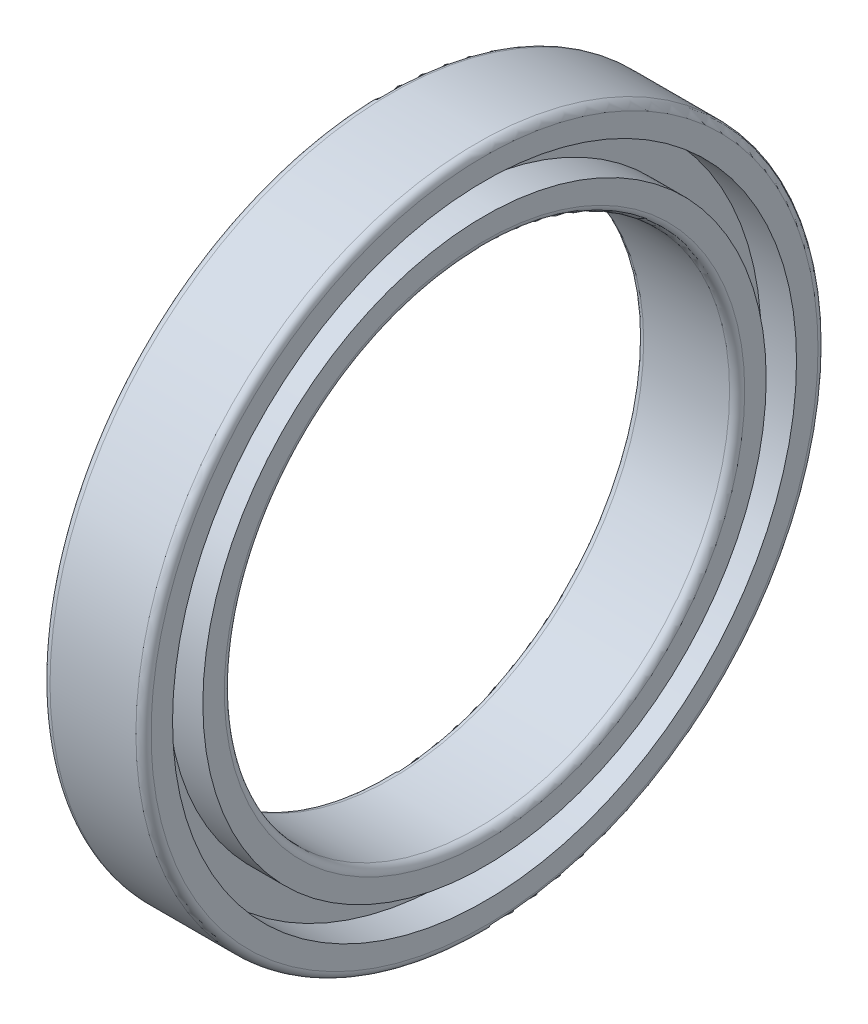
ISO-10303-21;
HEADER;
FILE_DESCRIPTION(('STEP AP214'),'2;1');
FILE_NAME('part.step','',(''),(''),'','','');
FILE_SCHEMA(('AUTOMOTIVE_DESIGN { 1 0 10303 214 1 1 1 1 }'));
ENDSEC;
DATA;
#1=APPLICATION_CONTEXT('core data for automotive mechanical design processes');
#2=APPLICATION_PROTOCOL_DEFINITION('international standard','automotive_design',2000,#1);
#3=PRODUCT_CONTEXT('',#1,'mechanical');
#4=PRODUCT('Part','Part','',(#3));
#5=PRODUCT_RELATED_PRODUCT_CATEGORY('part','',(#4));
#6=PRODUCT_DEFINITION_FORMATION('','',#4);
#7=PRODUCT_DEFINITION_CONTEXT('part definition',#1,'design');
#8=PRODUCT_DEFINITION('design','',#6,#7);
#9=PRODUCT_DEFINITION_SHAPE('','',#8);
#10=(LENGTH_UNIT() NAMED_UNIT(*) SI_UNIT(.MILLI.,.METRE.));
#11=(NAMED_UNIT(*) PLANE_ANGLE_UNIT() SI_UNIT($,.RADIAN.));
#12=(NAMED_UNIT(*) SI_UNIT($,.STERADIAN.) SOLID_ANGLE_UNIT());
#13=UNCERTAINTY_MEASURE_WITH_UNIT(LENGTH_MEASURE(1.E-05),#10,'distance_accuracy_value','');
#14=(GEOMETRIC_REPRESENTATION_CONTEXT(3) GLOBAL_UNCERTAINTY_ASSIGNED_CONTEXT((#13)) GLOBAL_UNIT_ASSIGNED_CONTEXT((#10,
#11,#12)) REPRESENTATION_CONTEXT('',''));
#15=CARTESIAN_POINT('',(0.,0.,0.));
#16=DIRECTION('',(0.,0.,1.));
#17=DIRECTION('',(1.,0.,0.));
#18=AXIS2_PLACEMENT_3D('',#15,#16,#17);
#19=CARTESIAN_POINT('',(-1.7,0.,0.));
#20=DIRECTION('',(1.,0.,0.));
#21=DIRECTION('',(0.,0.,-1.));
#22=AXIS2_PLACEMENT_3D('',#19,#20,#21);
#23=TOROIDAL_SURFACE('',#22,13.2,0.3);
#24=CARTESIAN_POINT('',(-2.,0.,0.));
#25=DIRECTION('',(1.,0.,0.));
#26=DIRECTION('',(0.,0.,-1.));
#27=AXIS2_PLACEMENT_3D('',#24,#25,#26);
#28=CIRCLE('',#27,13.2);
#29=CARTESIAN_POINT('',(-2.,0.,-13.2));
#30=VERTEX_POINT('',#29);
#31=EDGE_CURVE('E10',#30,#30,#28,.T.);
#32=ORIENTED_EDGE('',*,*,#31,.T.);
#33=EDGE_LOOP('',(#32));
#34=FACE_BOUND('',#33,.T.);
#35=CARTESIAN_POINT('',(-1.7,0.,0.));
#36=DIRECTION('',(1.,0.,0.));
#37=DIRECTION('',(0.,0.,-1.));
#38=AXIS2_PLACEMENT_3D('',#35,#36,#37);
#39=CIRCLE('',#38,13.5);
#40=CARTESIAN_POINT('',(-1.7,0.,-13.5));
#41=VERTEX_POINT('',#40);
#42=EDGE_CURVE('E121',#41,#41,#39,.T.);
#43=ORIENTED_EDGE('',*,*,#42,.F.);
#44=EDGE_LOOP('',(#43));
#45=FACE_BOUND('',#44,.T.);
#46=ADVANCED_FACE('F16',(#34,#45),#23,.T.);
#47=CARTESIAN_POINT('',(-2.,12.35,0.));
#48=DIRECTION('',(1.,0.,0.));
#49=DIRECTION('',(0.,1.,0.));
#50=AXIS2_PLACEMENT_3D('',#47,#48,#49);
#51=PLANE('',#50);
#52=CARTESIAN_POINT('',(-2.,0.,0.));
#53=DIRECTION('',(1.,0.,0.));
#54=DIRECTION('',(0.,0.,-1.));
#55=AXIS2_PLACEMENT_3D('',#52,#53,#54);
#56=CIRCLE('',#55,12.35);
#57=CARTESIAN_POINT('',(-2.,0.,-12.35));
#58=VERTEX_POINT('',#57);
#59=EDGE_CURVE('E25',#58,#58,#56,.T.);
#60=ORIENTED_EDGE('',*,*,#59,.T.);
#61=EDGE_LOOP('',(#60));
#62=FACE_BOUND('',#61,.T.);
#63=ORIENTED_EDGE('',*,*,#31,.F.);
#64=EDGE_LOOP('',(#63));
#65=FACE_BOUND('',#64,.T.);
#66=ADVANCED_FACE('F157',(#62,#65),#51,.F.);
#67=CARTESIAN_POINT('',(2.,0.,0.));
#68=DIRECTION('',(-1.,0.,0.));
#69=DIRECTION('',(0.,0.,-1.));
#70=AXIS2_PLACEMENT_3D('',#67,#68,#69);
#71=CYLINDRICAL_SURFACE('',#70,12.35);
#72=ORIENTED_EDGE('',*,*,#59,.F.);
#73=EDGE_LOOP('',(#72));
#74=FACE_BOUND('',#73,.T.);
#75=CARTESIAN_POINT('',(-0.6,0.,0.));
#76=DIRECTION('',(1.,0.,0.));
#77=DIRECTION('',(0.,0.,-1.));
#78=AXIS2_PLACEMENT_3D('',#75,#76,#77);
#79=CIRCLE('',#78,12.35);
#80=CARTESIAN_POINT('',(-0.6,0.,-12.35));
#81=VERTEX_POINT('',#80);
#82=EDGE_CURVE('E136',#81,#81,#79,.T.);
#83=ORIENTED_EDGE('',*,*,#82,.T.);
#84=EDGE_LOOP('',(#83));
#85=FACE_BOUND('',#84,.T.);
#86=ADVANCED_FACE('F142',(#74,#85),#71,.F.);
#87=CARTESIAN_POINT('',(-0.6,11.15,0.));
#88=DIRECTION('',(1.,0.,0.));
#89=DIRECTION('',(0.,1.,0.));
#90=AXIS2_PLACEMENT_3D('',#87,#88,#89);
#91=PLANE('',#90);
#92=CARTESIAN_POINT('',(-0.6,0.,0.));
#93=DIRECTION('',(1.,0.,0.));
#94=DIRECTION('',(0.,0.,-1.));
#95=AXIS2_PLACEMENT_3D('',#92,#93,#94);
#96=CIRCLE('',#95,11.15);
#97=CARTESIAN_POINT('',(-0.6,0.,-11.15));
#98=VERTEX_POINT('',#97);
#99=EDGE_CURVE('E107',#98,#98,#96,.T.);
#100=ORIENTED_EDGE('',*,*,#99,.T.);
#101=EDGE_LOOP('',(#100));
#102=FACE_BOUND('',#101,.T.);
#103=ORIENTED_EDGE('',*,*,#82,.F.);
#104=EDGE_LOOP('',(#103));
#105=FACE_BOUND('',#104,.T.);
#106=ADVANCED_FACE('F144',(#102,#105),#91,.F.);
#107=CARTESIAN_POINT('',(1.7,0.,0.));
#108=DIRECTION('',(1.,0.,0.));
#109=DIRECTION('',(0.,0.,-1.));
#110=AXIS2_PLACEMENT_3D('',#107,#108,#109);
#111=TOROIDAL_SURFACE('',#110,10.3,0.3);
#112=CARTESIAN_POINT('',(2.,0.,0.));
#113=DIRECTION('',(1.,0.,0.));
#114=DIRECTION('',(0.,0.,-1.));
#115=AXIS2_PLACEMENT_3D('',#112,#113,#114);
#116=CIRCLE('',#115,10.3);
#117=CARTESIAN_POINT('',(2.,0.,-10.3));
#118=VERTEX_POINT('',#117);
#119=EDGE_CURVE('E97',#118,#118,#116,.T.);
#120=ORIENTED_EDGE('',*,*,#119,.T.);
#121=EDGE_LOOP('',(#120));
#122=FACE_BOUND('',#121,.T.);
#123=CARTESIAN_POINT('',(1.7,0.,0.));
#124=DIRECTION('',(1.,0.,0.));
#125=DIRECTION('',(0.,0.,-1.));
#126=AXIS2_PLACEMENT_3D('',#123,#124,#125);
#127=CIRCLE('',#126,10.);
#128=CARTESIAN_POINT('',(1.7,0.,-10.));
#129=VERTEX_POINT('',#128);
#130=EDGE_CURVE('E133',#129,#129,#127,.T.);
#131=ORIENTED_EDGE('',*,*,#130,.F.);
#132=EDGE_LOOP('',(#131));
#133=FACE_BOUND('',#132,.T.);
#134=ADVANCED_FACE('F146',(#122,#133),#111,.T.);
#135=CARTESIAN_POINT('',(50.,0.,0.));
#136=DIRECTION('',(-1.,0.,0.));
#137=DIRECTION('',(0.,0.,-1.));
#138=AXIS2_PLACEMENT_3D('',#135,#136,#137);
#139=CYLINDRICAL_SURFACE('',#138,10.);
#140=ORIENTED_EDGE('',*,*,#130,.T.);
#141=EDGE_LOOP('',(#140));
#142=FACE_BOUND('',#141,.T.);
#143=CARTESIAN_POINT('',(-1.7,0.,0.));
#144=DIRECTION('',(1.,0.,0.));
#145=DIRECTION('',(0.,0.,-1.));
#146=AXIS2_PLACEMENT_3D('',#143,#144,#145);
#147=CIRCLE('',#146,10.);
#148=CARTESIAN_POINT('',(-1.7,0.,-10.));
#149=VERTEX_POINT('',#148);
#150=EDGE_CURVE('E130',#149,#149,#147,.T.);
#151=ORIENTED_EDGE('',*,*,#150,.F.);
#152=EDGE_LOOP('',(#151));
#153=FACE_BOUND('',#152,.T.);
#154=ADVANCED_FACE('F154',(#142,#153),#139,.F.);
#155=CARTESIAN_POINT('',(-1.7,0.,0.));
#156=DIRECTION('',(1.,0.,0.));
#157=DIRECTION('',(0.,0.,-1.));
#158=AXIS2_PLACEMENT_3D('',#155,#156,#157);
#159=TOROIDAL_SURFACE('',#158,10.3,0.3);
#160=ORIENTED_EDGE('',*,*,#150,.T.);
#161=EDGE_LOOP('',(#160));
#162=FACE_BOUND('',#161,.T.);
#163=CARTESIAN_POINT('',(-2.,0.,0.));
#164=DIRECTION('',(1.,0.,0.));
#165=DIRECTION('',(0.,0.,-1.));
#166=AXIS2_PLACEMENT_3D('',#163,#164,#165);
#167=CIRCLE('',#166,10.3);
#168=CARTESIAN_POINT('',(-2.,0.,-10.3));
#169=VERTEX_POINT('',#168);
#170=EDGE_CURVE('E104',#169,#169,#167,.T.);
#171=ORIENTED_EDGE('',*,*,#170,.F.);
#172=EDGE_LOOP('',(#171));
#173=FACE_BOUND('',#172,.T.);
#174=ADVANCED_FACE('F187',(#162,#173),#159,.T.);
#175=CARTESIAN_POINT('',(2.,0.,0.));
#176=DIRECTION('',(-1.,0.,0.));
#177=DIRECTION('',(0.,0.,-1.));
#178=AXIS2_PLACEMENT_3D('',#175,#176,#177);
#179=CYLINDRICAL_SURFACE('',#178,11.15);
#180=ORIENTED_EDGE('',*,*,#99,.F.);
#181=EDGE_LOOP('',(#180));
#182=FACE_BOUND('',#181,.T.);
#183=CARTESIAN_POINT('',(-2.,0.,0.));
#184=DIRECTION('',(1.,0.,0.));
#185=DIRECTION('',(0.,0.,-1.));
#186=AXIS2_PLACEMENT_3D('',#183,#184,#185);
#187=CIRCLE('',#186,11.15);
#188=CARTESIAN_POINT('',(-2.,0.,-11.15));
#189=VERTEX_POINT('',#188);
#190=EDGE_CURVE('E108',#189,#189,#187,.T.);
#191=ORIENTED_EDGE('',*,*,#190,.T.);
#192=EDGE_LOOP('',(#191));
#193=FACE_BOUND('',#192,.T.);
#194=ADVANCED_FACE('F181',(#182,#193),#179,.T.);
#195=CARTESIAN_POINT('',(-2.,0.,0.));
#196=DIRECTION('',(1.,0.,0.));
#197=DIRECTION('',(0.,1.,0.));
#198=AXIS2_PLACEMENT_3D('',#195,#196,#197);
#199=PLANE('',#198);
#200=ORIENTED_EDGE('',*,*,#170,.T.);
#201=EDGE_LOOP('',(#200));
#202=FACE_BOUND('',#201,.T.);
#203=ORIENTED_EDGE('',*,*,#190,.F.);
#204=EDGE_LOOP('',(#203));
#205=FACE_BOUND('',#204,.T.);
#206=ADVANCED_FACE('F171',(#202,#205),#199,.F.);
#207=CARTESIAN_POINT('',(2.,0.,0.));
#208=DIRECTION('',(-1.,0.,0.));
#209=DIRECTION('',(0.,0.,-1.));
#210=AXIS2_PLACEMENT_3D('',#207,#208,#209);
#211=CYLINDRICAL_SURFACE('',#210,13.5);
#212=CARTESIAN_POINT('',(1.7,0.,0.));
#213=DIRECTION('',(1.,0.,0.));
#214=DIRECTION('',(0.,0.,-1.));
#215=AXIS2_PLACEMENT_3D('',#212,#213,#214);
#216=CIRCLE('',#215,13.5);
#217=CARTESIAN_POINT('',(1.7,0.,-13.5));
#218=VERTEX_POINT('',#217);
#219=EDGE_CURVE('E120',#218,#218,#216,.T.);
#220=ORIENTED_EDGE('',*,*,#219,.F.);
#221=EDGE_LOOP('',(#220));
#222=FACE_BOUND('',#221,.T.);
#223=ORIENTED_EDGE('',*,*,#42,.T.);
#224=EDGE_LOOP('',(#223));
#225=FACE_BOUND('',#224,.T.);
#226=ADVANCED_FACE('F168',(#222,#225),#211,.T.);
#227=CARTESIAN_POINT('',(1.7,0.,0.));
#228=DIRECTION('',(1.,0.,0.));
#229=DIRECTION('',(0.,0.,-1.));
#230=AXIS2_PLACEMENT_3D('',#227,#228,#229);
#231=TOROIDAL_SURFACE('',#230,13.2,0.3);
#232=ORIENTED_EDGE('',*,*,#219,.T.);
#233=EDGE_LOOP('',(#232));
#234=FACE_BOUND('',#233,.T.);
#235=CARTESIAN_POINT('',(2.,0.,0.));
#236=DIRECTION('',(1.,0.,0.));
#237=DIRECTION('',(0.,0.,-1.));
#238=AXIS2_PLACEMENT_3D('',#235,#236,#237);
#239=CIRCLE('',#238,13.2);
#240=CARTESIAN_POINT('',(2.,0.,-13.2));
#241=VERTEX_POINT('',#240);
#242=EDGE_CURVE('E117',#241,#241,#239,.T.);
#243=ORIENTED_EDGE('',*,*,#242,.F.);
#244=EDGE_LOOP('',(#243));
#245=FACE_BOUND('',#244,.T.);
#246=ADVANCED_FACE('F170',(#234,#245),#231,.T.);
#247=CARTESIAN_POINT('',(2.,13.2,0.));
#248=DIRECTION('',(-1.,0.,0.));
#249=DIRECTION('',(0.,0.,1.));
#250=AXIS2_PLACEMENT_3D('',#247,#248,#249);
#251=PLANE('',#250);
#252=CARTESIAN_POINT('',(2.,0.,0.));
#253=DIRECTION('',(1.,0.,0.));
#254=DIRECTION('',(0.,0.,-1.));
#255=AXIS2_PLACEMENT_3D('',#252,#253,#254);
#256=CIRCLE('',#255,12.35);
#257=CARTESIAN_POINT('',(2.,0.,-12.35));
#258=VERTEX_POINT('',#257);
#259=EDGE_CURVE('E114',#258,#258,#256,.T.);
#260=ORIENTED_EDGE('',*,*,#259,.F.);
#261=EDGE_LOOP('',(#260));
#262=FACE_BOUND('',#261,.T.);
#263=ORIENTED_EDGE('',*,*,#242,.T.);
#264=EDGE_LOOP('',(#263));
#265=FACE_BOUND('',#264,.T.);
#266=ADVANCED_FACE('F178',(#262,#265),#251,.F.);
#267=CARTESIAN_POINT('',(2.,0.,0.));
#268=DIRECTION('',(-1.,0.,0.));
#269=DIRECTION('',(0.,0.,-1.));
#270=AXIS2_PLACEMENT_3D('',#267,#268,#269);
#271=CYLINDRICAL_SURFACE('',#270,12.35);
#272=CARTESIAN_POINT('',(0.6,0.,0.));
#273=DIRECTION('',(1.,0.,0.));
#274=DIRECTION('',(0.,0.,-1.));
#275=AXIS2_PLACEMENT_3D('',#272,#273,#274);
#276=CIRCLE('',#275,12.35);
#277=CARTESIAN_POINT('',(0.6,0.,-12.35));
#278=VERTEX_POINT('',#277);
#279=EDGE_CURVE('E111',#278,#278,#276,.T.);
#280=ORIENTED_EDGE('',*,*,#279,.F.);
#281=EDGE_LOOP('',(#280));
#282=FACE_BOUND('',#281,.T.);
#283=ORIENTED_EDGE('',*,*,#259,.T.);
#284=EDGE_LOOP('',(#283));
#285=FACE_BOUND('',#284,.T.);
#286=ADVANCED_FACE('F212',(#282,#285),#271,.F.);
#287=CARTESIAN_POINT('',(0.6,12.35,0.));
#288=DIRECTION('',(-1.,0.,0.));
#289=DIRECTION('',(0.,0.,1.));
#290=AXIS2_PLACEMENT_3D('',#287,#288,#289);
#291=PLANE('',#290);
#292=CARTESIAN_POINT('',(0.6,0.,0.));
#293=DIRECTION('',(1.,0.,0.));
#294=DIRECTION('',(0.,0.,-1.));
#295=AXIS2_PLACEMENT_3D('',#292,#293,#294);
#296=CIRCLE('',#295,11.15);
#297=CARTESIAN_POINT('',(0.6,0.,-11.15));
#298=VERTEX_POINT('',#297);
#299=EDGE_CURVE('E101',#298,#298,#296,.T.);
#300=ORIENTED_EDGE('',*,*,#299,.F.);
#301=EDGE_LOOP('',(#300));
#302=FACE_BOUND('',#301,.T.);
#303=ORIENTED_EDGE('',*,*,#279,.T.);
#304=EDGE_LOOP('',(#303));
#305=FACE_BOUND('',#304,.T.);
#306=ADVANCED_FACE('F210',(#302,#305),#291,.F.);
#307=CARTESIAN_POINT('',(2.,0.,0.));
#308=DIRECTION('',(-1.,0.,0.));
#309=DIRECTION('',(0.,0.,-1.));
#310=AXIS2_PLACEMENT_3D('',#307,#308,#309);
#311=CYLINDRICAL_SURFACE('',#310,11.15);
#312=CARTESIAN_POINT('',(2.,0.,0.));
#313=DIRECTION('',(1.,0.,0.));
#314=DIRECTION('',(0.,0.,-1.));
#315=AXIS2_PLACEMENT_3D('',#312,#313,#314);
#316=CIRCLE('',#315,11.15);
#317=CARTESIAN_POINT('',(2.,0.,-11.15));
#318=VERTEX_POINT('',#317);
#319=EDGE_CURVE('E93',#318,#318,#316,.T.);
#320=ORIENTED_EDGE('',*,*,#319,.F.);
#321=EDGE_LOOP('',(#320));
#322=FACE_BOUND('',#321,.T.);
#323=ORIENTED_EDGE('',*,*,#299,.T.);
#324=EDGE_LOOP('',(#323));
#325=FACE_BOUND('',#324,.T.);
#326=ADVANCED_FACE('F208',(#322,#325),#311,.T.);
#327=CARTESIAN_POINT('',(2.,11.15,0.));
#328=DIRECTION('',(-1.,0.,0.));
#329=DIRECTION('',(0.,0.,1.));
#330=AXIS2_PLACEMENT_3D('',#327,#328,#329);
#331=PLANE('',#330);
#332=ORIENTED_EDGE('',*,*,#119,.F.);
#333=EDGE_LOOP('',(#332));
#334=FACE_BOUND('',#333,.T.);
#335=ORIENTED_EDGE('',*,*,#319,.T.);
#336=EDGE_LOOP('',(#335));
#337=FACE_BOUND('',#336,.T.);
#338=ADVANCED_FACE('F94',(#334,#337),#331,.F.);
#339=CLOSED_SHELL('',(#46,#66,#86,#106,#134,#154,#174,#194,#206,#226,#246,#266,#286,#306,#326,#338));
#340=MANIFOLD_SOLID_BREP('B1',#339);
#341=ADVANCED_BREP_SHAPE_REPRESENTATION('',(#18,#340),#14);
#342=SHAPE_DEFINITION_REPRESENTATION(#9,#341);
ENDSEC;
END-ISO-10303-21;
